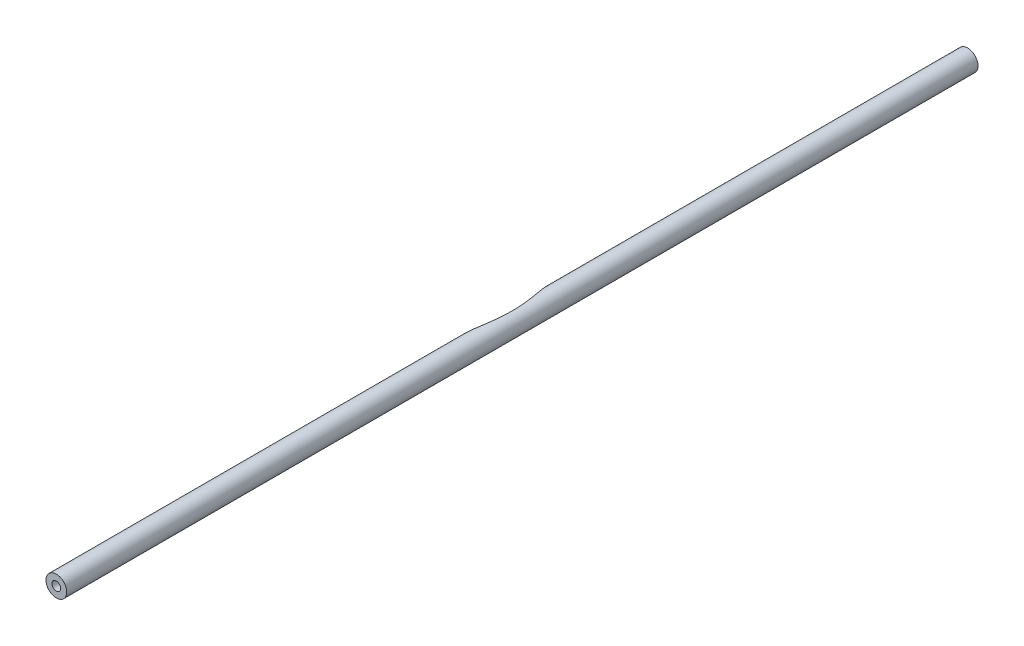
ISO-10303-21;
HEADER;
FILE_DESCRIPTION(('STEP AP214'),'2;1');
FILE_NAME('part.step','',(''),(''),'','','');
FILE_SCHEMA(('AUTOMOTIVE_DESIGN { 1 0 10303 214 1 1 1 1 }'));
ENDSEC;
DATA;
#1=APPLICATION_CONTEXT('core data for automotive mechanical design processes');
#2=APPLICATION_PROTOCOL_DEFINITION('international standard','automotive_design',2000,#1);
#3=PRODUCT_CONTEXT('',#1,'mechanical');
#4=PRODUCT('Part','Part','',(#3));
#5=PRODUCT_RELATED_PRODUCT_CATEGORY('part','',(#4));
#6=PRODUCT_DEFINITION_FORMATION('','',#4);
#7=PRODUCT_DEFINITION_CONTEXT('part definition',#1,'design');
#8=PRODUCT_DEFINITION('design','',#6,#7);
#9=PRODUCT_DEFINITION_SHAPE('','',#8);
#10=(LENGTH_UNIT() NAMED_UNIT(*) SI_UNIT(.MILLI.,.METRE.));
#11=(NAMED_UNIT(*) PLANE_ANGLE_UNIT() SI_UNIT($,.RADIAN.));
#12=(NAMED_UNIT(*) SI_UNIT($,.STERADIAN.) SOLID_ANGLE_UNIT());
#13=UNCERTAINTY_MEASURE_WITH_UNIT(LENGTH_MEASURE(1.E-05),#10,'distance_accuracy_value','');
#14=(GEOMETRIC_REPRESENTATION_CONTEXT(3) GLOBAL_UNCERTAINTY_ASSIGNED_CONTEXT((#13)) GLOBAL_UNIT_ASSIGNED_CONTEXT((#10,
#11,#12)) REPRESENTATION_CONTEXT('',''));
#15=CARTESIAN_POINT('',(0.,0.,0.));
#16=DIRECTION('',(0.,0.,1.));
#17=DIRECTION('',(1.,0.,0.));
#18=AXIS2_PLACEMENT_3D('',#15,#16,#17);
#19=CARTESIAN_POINT('',(0.,0.,-220.));
#20=DIRECTION('',(0.,0.,1.));
#21=DIRECTION('',(1.,0.,0.));
#22=AXIS2_PLACEMENT_3D('',#19,#20,#21);
#23=CYLINDRICAL_SURFACE('',#22,5.);
#24=CARTESIAN_POINT('',(0.,-5.,0.));
#25=CARTESIAN_POINT('',(5.98048745554765E-08,-4.99999894929826,0.417707577918695));
#26=CARTESIAN_POINT('',(-0.00447316842454203,-5.00000572152815,0.835411787074295));
#27=CARTESIAN_POINT('',(-0.0223640327096948,-4.99995826664365,1.67063726628699));
#28=CARTESIAN_POINT('',(-0.0357818154025074,-4.99990403852922,2.08815853323263));
#29=CARTESIAN_POINT('',(-0.0715571107148975,-4.99951986270451,2.92284683246875));
#30=CARTESIAN_POINT('',(-0.093915253298219,-4.99918989556309,3.34001383772069));
#31=CARTESIAN_POINT('',(-0.147560909040328,-4.99789414244653,4.17377229868555));
#32=CARTESIAN_POINT('',(-0.178848415093095,-4.99692835697739,4.59036375485623));
#33=CARTESIAN_POINT('',(-0.250516912833014,-4.99384966328313,5.42485904522883));
#34=CARTESIAN_POINT('',(-0.290942601030743,-4.9917310421289,5.84275902287125));
#35=CARTESIAN_POINT('',(-0.380776889621688,-4.98568309811106,6.67756891637324));
#36=CARTESIAN_POINT('',(-0.430185249470323,-4.98175382373013,7.09447885844192));
#37=CARTESIAN_POINT('',(-0.537946149838968,-4.97127192769807,7.92700720253108));
#38=CARTESIAN_POINT('',(-0.596296518090961,-4.96471994255644,8.34262589328153));
#39=CARTESIAN_POINT('',(-0.721914687736447,-4.94801526105068,9.17244265001416));
#40=CARTESIAN_POINT('',(-0.789182464997791,-4.93786257443059,9.58664071983768));
#41=CARTESIAN_POINT('',(-0.933276458326981,-4.91267729887402,10.4173326026176));
#42=CARTESIAN_POINT('',(-1.01018833746266,-4.89759874104744,10.833810212722));
#43=CARTESIAN_POINT('',(-1.17298344626658,-4.86117992039492,11.6647497447607));
#44=CARTESIAN_POINT('',(-1.25886686101188,-4.8398395283749,12.0792116249271));
#45=CARTESIAN_POINT('',(-1.43961253536604,-4.78918996446184,12.9062380219548));
#46=CARTESIAN_POINT('',(-1.53448584242253,-4.75987090279358,13.3187995335351));
#47=CARTESIAN_POINT('',(-1.73295806585678,-4.69125655935509,14.1409755672814));
#48=CARTESIAN_POINT('',(-1.83655647630113,-4.65196185576615,14.5505902588285));
#49=CARTESIAN_POINT('',(-2.05119630868726,-4.56136432500578,15.3622576083071));
#50=CARTESIAN_POINT('',(-2.16215573942821,-4.51018173657426,15.7643450754205));
#51=CARTESIAN_POINT('',(-2.39205353093678,-4.39258063984198,16.5641301472363));
#52=CARTESIAN_POINT('',(-2.51099391724757,-4.32615825329774,16.9618266074618));
#53=CARTESIAN_POINT('',(-2.75595276751979,-4.1743871634479,17.7504204575874));
#54=CARTESIAN_POINT('',(-2.88195345236026,-4.08908453415532,18.141331942608));
#55=CARTESIAN_POINT('',(-3.07561444599291,-3.94297844044993,18.7214304560374));
#56=CARTESIAN_POINT('',(-3.14092813653961,-3.89126599845971,18.9137053253748));
#57=CARTESIAN_POINT('',(-3.27291756123801,-3.78092947356627,19.2957785272647));
#58=CARTESIAN_POINT('',(-3.33959310017675,-3.72230637559598,19.4855772084607));
#59=CARTESIAN_POINT('',(-3.4550485975607,-3.61482685309579,19.8089507462537));
#60=CARTESIAN_POINT('',(-3.5035621669071,-3.56789073737287,19.9432597367399));
#61=CARTESIAN_POINT('',(-3.60102978249993,-3.46949324082166,20.2100677064277));
#62=CARTESIAN_POINT('',(-3.64998385939631,-3.41803154288915,20.3425665580414));
#63=CARTESIAN_POINT('',(-3.74840145702304,-3.30981319751915,20.6060412811268));
#64=CARTESIAN_POINT('',(-3.79786629663304,-3.25303213476149,20.7370066814364));
#65=CARTESIAN_POINT('',(-3.89684911100639,-3.13377886897074,20.9963049304593));
#66=CARTESIAN_POINT('',(-3.94636708508716,-3.07130673820151,21.1246378125743));
#67=CARTESIAN_POINT('',(-4.0583744899826,-2.92240687947659,21.4119600522195));
#68=CARTESIAN_POINT('',(-4.12079582371169,-2.83403755291774,21.5699820603759));
#69=CARTESIAN_POINT('',(-4.24450302227461,-2.64517546126514,21.8793407723043));
#70=CARTESIAN_POINT('',(-4.30578799815116,-2.54467363141446,22.0306723605752));
#71=CARTESIAN_POINT('',(-4.42554418584407,-2.33014315793481,22.3230476914135));
#72=CARTESIAN_POINT('',(-4.48403120980962,-2.2162075099452,22.46415237343));
#73=CARTESIAN_POINT('',(-4.59666555955973,-1.97198377312469,22.7331393980527));
#74=CARTESIAN_POINT('',(-4.65082170328285,-1.84173037274067,22.8610487696205));
#75=CARTESIAN_POINT('',(-4.73861581976625,-1.59920289141532,23.0666309914176));
#76=CARTESIAN_POINT('',(-4.77389781162023,-1.49124978202251,23.1486551281293));
#77=CARTESIAN_POINT('',(-4.83891610417778,-1.26443681624317,23.29900583807));
#78=CARTESIAN_POINT('',(-4.86865151062822,-1.14557520572506,23.367330202674));
#79=CARTESIAN_POINT('',(-4.92074634297944,-0.895917136765003,23.4865591897872));
#80=CARTESIAN_POINT('',(-4.94301626272151,-0.764998292298065,23.5372526824804));
#81=CARTESIAN_POINT('',(-4.97727873542102,-0.495060259673294,23.615078014192));
#82=CARTESIAN_POINT('',(-4.98928950333902,-0.356055898049044,23.6422516135542));
#83=CARTESIAN_POINT('',(-5.00086145217875,-0.0878465005493869,23.6684298248628));
#84=CARTESIAN_POINT('',(-5.00146832610088,0.0410804679665408,23.6698004893668));
#85=CARTESIAN_POINT('',(-4.99281860096677,0.296897078185104,23.6502365726649));
#86=CARTESIAN_POINT('',(-4.98355903660584,0.423786095755256,23.6292952857228));
#87=CARTESIAN_POINT('',(-4.95765176713256,0.659020949234648,23.5705145160179));
#88=CARTESIAN_POINT('',(-4.94183603255899,0.767951797868487,23.5345755455366));
#89=CARTESIAN_POINT('',(-4.90435858571185,0.979174856142201,23.4490862577332));
#90=CARTESIAN_POINT('',(-4.88269556383135,1.08146557222871,23.3995328911737));
#91=CARTESIAN_POINT('',(-4.81866123379227,1.34513083251545,23.2523616480387));
#92=CARTESIAN_POINT('',(-4.77216345157935,1.49995332389845,23.1448369665749));
#93=CARTESIAN_POINT('',(-4.67117731406636,1.78992752846766,22.908947584942));
#94=CARTESIAN_POINT('',(-4.61666335516293,1.92501333905605,22.7805159619968));
#95=CARTESIAN_POINT('',(-4.50864107046932,2.16509944776037,22.5231624157064));
#96=CARTESIAN_POINT('',(-4.45557681472885,2.2717572816773,22.3955724996858));
#97=CARTESIAN_POINT('',(-4.34713066799162,2.47295988476688,22.1320113266715));
#98=CARTESIAN_POINT('',(-4.29174682876626,2.56749418925142,21.9960329769543));
#99=CARTESIAN_POINT('',(-4.17963997540246,2.746224434971,21.7176537118176));
#100=CARTESIAN_POINT('',(-4.12291474191421,2.83040157061374,21.5752417373478));
#101=CARTESIAN_POINT('',(-4.00895001023727,2.98963070380607,21.2857140963652));
#102=CARTESIAN_POINT('',(-3.95171068076745,3.06468558551102,21.1385999352048));
#103=CARTESIAN_POINT('',(-3.81518927863015,3.23424385263108,20.7833642684202));
#104=CARTESIAN_POINT('',(-3.73589133750635,3.32513377597189,20.5735284040891));
#105=CARTESIAN_POINT('',(-3.57812215954788,3.49433882596433,20.1484968506665));
#106=CARTESIAN_POINT('',(-3.49965130362046,3.57264837663004,19.9332988334577));
#107=CARTESIAN_POINT('',(-3.34403500787087,3.71871347698896,19.4984942399071));
#108=CARTESIAN_POINT('',(-3.26689180383332,3.78645252897069,19.2788813643417));
#109=CARTESIAN_POINT('',(-3.11445722550238,3.91279318531084,18.836403085515));
#110=CARTESIAN_POINT('',(-3.03916605237586,3.97139380071502,18.6135373330801));
#111=CARTESIAN_POINT('',(-2.89038820126432,4.08095905435596,18.1641524546045));
#112=CARTESIAN_POINT('',(-2.81691144223542,4.13188724490038,17.9376212227885));
#113=CARTESIAN_POINT('',(-2.67233229186991,4.22683294591725,17.4823677884966));
#114=CARTESIAN_POINT('',(-2.60122995756532,4.27085029048982,17.2536455335633));
#115=CARTESIAN_POINT('',(-2.4616204800005,4.35281166107828,16.7945776609003));
#116=CARTESIAN_POINT('',(-2.39311095423915,4.39076137135174,16.5642337761102));
#117=CARTESIAN_POINT('',(-2.25872982157521,4.46137833592859,16.1019761793677));
#118=CARTESIAN_POINT('',(-2.19285824607814,4.49404552735619,15.8700624487643));
#119=CARTESIAN_POINT('',(-2.03552082237394,4.56806231785457,15.3027714117898));
#120=CARTESIAN_POINT('',(-1.94551276347614,4.60692856019252,14.9666646355142));
#121=CARTESIAN_POINT('',(-1.77131858604969,4.67666797983993,14.2921055697647));
#122=CARTESIAN_POINT('',(-1.68713299853558,4.70754042881098,13.9536530694474));
#123=CARTESIAN_POINT('',(-1.52469116776363,4.76263303975246,13.2746838356438));
#124=CARTESIAN_POINT('',(-1.44643677561239,4.78685113106004,12.9341664932454));
#125=CARTESIAN_POINT('',(-1.29597173374623,4.82975926801606,12.251442265691));
#126=CARTESIAN_POINT('',(-1.22376136226745,4.84844905926977,11.9092353035206));
#127=CARTESIAN_POINT('',(-1.08533283066156,4.88130345704158,11.2227882710711));
#128=CARTESIAN_POINT('',(-1.01912511296981,4.8954602821677,10.8785457269558));
#129=CARTESIAN_POINT('',(-0.892885290295208,4.92004868156309,10.1887941166971));
#130=CARTESIAN_POINT('',(-0.832853374170817,4.93048014193332,9.84328501215625));
#131=CARTESIAN_POINT('',(-0.662096693171913,4.9573166434217,8.80523704503186));
#132=CARTESIAN_POINT('',(-0.560681077744827,4.96927022676488,8.11102918444866));
#133=CARTESIAN_POINT('',(-0.382627653807178,4.98613878050529,6.71742238090323));
#134=CARTESIAN_POINT('',(-0.306059921917089,4.99103397607813,6.01801435046465));
#135=CARTESIAN_POINT('',(-0.178192763284592,4.99723410889104,4.61685389203272));
#136=CARTESIAN_POINT('',(-0.126894090998022,4.99853893893925,3.91510139467057));
#137=CARTESIAN_POINT('',(-0.0496845681267779,4.99990193877803,2.51105180493701));
#138=CARTESIAN_POINT('',(-0.0237431512179561,4.99996161128608,1.80875639205825));
#139=CARTESIAN_POINT('',(0.00282635921271862,5.00001651308659,0.403696282143364));
#140=CARTESIAN_POINT('',(0.00345474331280242,5.00001174311883,-0.299068409413122));
#141=CARTESIAN_POINT('',(-0.0212737604337173,4.99997248903954,-1.74338061257239));
#142=CARTESIAN_POINT('',(-0.0480828493019704,4.99993636143253,-2.48490364402855));
#143=CARTESIAN_POINT('',(-0.129883296499979,4.9984799157087,-3.966428072384));
#144=CARTESIAN_POINT('',(-0.184875969276262,4.99705953302921,-4.7064293966965));
#145=CARTESIAN_POINT('',(-0.32311645583398,4.99002931721683,-6.18544552576326));
#146=CARTESIAN_POINT('',(-0.406427511585859,4.98441007303086,-6.92445437286473));
#147=CARTESIAN_POINT('',(-0.601138723460831,4.96470095620674,-8.39861632889281));
#148=CARTESIAN_POINT('',(-0.712535811322781,4.95061200860952,-9.13376985004545));
#149=CARTESIAN_POINT('',(-0.900022457428622,4.91872776623521,-10.229709825857));
#150=CARTESIAN_POINT('',(-0.965618757360426,4.90637733677826,-10.5924764825481));
#151=CARTESIAN_POINT('',(-1.10361884739612,4.87719336792466,-11.3165271404419));
#152=CARTESIAN_POINT('',(-1.17602238512838,4.86035999468635,-11.6778111960926));
#153=CARTESIAN_POINT('',(-1.32761741134307,4.82115785074906,-12.3988547234793));
#154=CARTESIAN_POINT('',(-1.40681246384122,4.79878616191937,-12.7586132894686));
#155=CARTESIAN_POINT('',(-1.57186967715843,4.74728385158903,-13.4761124320965));
#156=CARTESIAN_POINT('',(-1.65773169699531,4.71815337298638,-13.8338530512359));
#157=CARTESIAN_POINT('',(-1.83563464906013,4.6518195027973,-14.5454865755076));
#158=CARTESIAN_POINT('',(-1.92764887982078,4.61464960875957,-14.8993892325862));
#159=CARTESIAN_POINT('',(-2.11799634267435,4.53044496352307,-15.6043664571068));
#160=CARTESIAN_POINT('',(-2.21633017156963,4.48340927967874,-15.9554407539141));
#161=CARTESIAN_POINT('',(-2.41892972781871,4.37742395813588,-16.6536784982002));
#162=CARTESIAN_POINT('',(-2.52318921027998,4.31848670184364,-17.0008456173492));
#163=CARTESIAN_POINT('',(-2.73730142441431,4.18605551240326,-17.6906098240708));
#164=CARTESIAN_POINT('',(-2.84715252054131,4.11256581786924,-18.0332082114147));
#165=CARTESIAN_POINT('',(-3.00855727956513,3.99402902721136,-18.5212245243473));
#166=CARTESIAN_POINT('',(-3.05812064314116,3.95625636011384,-18.6690840073138));
#167=CARTESIAN_POINT('',(-3.15811067233034,3.87690827734068,-18.9634909480863));
#168=CARTESIAN_POINT('',(-3.20853733590509,3.83533287064292,-19.1100384089889));
#169=CARTESIAN_POINT('',(-3.31019586790912,3.74794593333724,-19.4017280300812));
#170=CARTESIAN_POINT('',(-3.36142834491129,3.70213105952785,-19.5468689797437));
#171=CARTESIAN_POINT('',(-3.4645356937074,3.60582453316669,-19.835371000051));
#172=CARTESIAN_POINT('',(-3.51641058075093,3.55533276940939,-19.9787320282814));
#173=CARTESIAN_POINT('',(-3.62061914395741,3.44915198741046,-20.2632796462795));
#174=CARTESIAN_POINT('',(-3.67295261919986,3.39346515130788,-20.4044671202528));
#175=CARTESIAN_POINT('',(-3.77788617497061,3.27624258323311,-20.6842886169932));
#176=CARTESIAN_POINT('',(-3.830486232349,3.21470735116598,-20.8229228567968));
#177=CARTESIAN_POINT('',(-3.93560958838556,3.08511452797687,-21.0969010162168));
#178=CARTESIAN_POINT('',(-3.98813289513612,3.01706582005104,-21.2322491102177));
#179=CARTESIAN_POINT('',(-4.09281334115064,2.87346114532701,-21.4991217212621));
#180=CARTESIAN_POINT('',(-4.14497039079215,2.79790340522222,-21.6306453256032));
#181=CARTESIAN_POINT('',(-4.2490356464422,2.63722899287747,-21.8903978721043));
#182=CARTESIAN_POINT('',(-4.30093270872887,2.55200521654226,-22.0185655742323));
#183=CARTESIAN_POINT('',(-4.40302962885606,2.37151381332953,-22.2682724218684));
#184=CARTESIAN_POINT('',(-4.45323058696051,2.27625286945055,-22.3898158971632));
#185=CARTESIAN_POINT('',(-4.55058117051233,2.07476703823351,-22.6234196658864));
#186=CARTESIAN_POINT('',(-4.59774798514415,1.96861479486142,-22.7355347421094));
#187=CARTESIAN_POINT('',(-4.68775565826909,1.74344961318782,-22.9477974436997));
#188=CARTESIAN_POINT('',(-4.73060405509848,1.62445986370747,-23.0479659813434));
#189=CARTESIAN_POINT('',(-4.80279286951076,1.39462907093936,-23.2156182144385));
#190=CARTESIAN_POINT('',(-4.83318182230714,1.28607312080306,-23.2857489807822));
#191=CARTESIAN_POINT('',(-4.88790014574705,1.05925529374103,-23.4114791582528));
#192=CARTESIAN_POINT('',(-4.912229605467,0.940993559527317,-23.4670787829926));
#193=CARTESIAN_POINT('',(-4.95309947591493,0.694635667842514,-23.5602064305963));
#194=CARTESIAN_POINT('',(-4.96955541381221,0.56644928241826,-23.5975385590483));
#195=CARTESIAN_POINT('',(-4.99242791172136,0.304692740658139,-23.649368255959));
#196=CARTESIAN_POINT('',(-4.99885816707036,0.171130184773462,-23.6638969746362));
#197=CARTESIAN_POINT('',(-5.00076984518739,-0.0840203338153848,-23.6682184938556));
#198=CARTESIAN_POINT('',(-4.99721263935676,-0.205568404330698,-23.6601832411598));
#199=CARTESIAN_POINT('',(-4.98158631641885,-0.445255259733036,-23.624808374983));
#200=CARTESIAN_POINT('',(-4.96951164077635,-0.563391765783324,-23.5974561551575));
#201=CARTESIAN_POINT('',(-4.93471890414986,-0.817483181249368,-23.518370052202));
#202=CARTESIAN_POINT('',(-4.91029782549125,-0.951967852026539,-23.4627213271827));
#203=CARTESIAN_POINT('',(-4.85334125008006,-1.20936329893185,-23.3321716114533));
#204=CARTESIAN_POINT('',(-4.82079085156077,-1.33225224268384,-23.2572352569975));
#205=CARTESIAN_POINT('',(-4.75787439599084,-1.54001393168273,-23.1113831253995));
#206=CARTESIAN_POINT('',(-4.72863425825511,-1.62726085006484,-23.0432837490642));
#207=CARTESIAN_POINT('',(-4.66754990843844,-1.79497863751702,-22.9001913827597));
#208=CARTESIAN_POINT('',(-4.63570416327731,-1.87544545999514,-22.825194331088));
#209=CARTESIAN_POINT('',(-4.57006186657282,-2.03017508349517,-22.6696342556695));
#210=CARTESIAN_POINT('',(-4.53626225687056,-2.10442768778631,-22.5890624653725));
#211=CARTESIAN_POINT('',(-4.4672712558021,-2.24716791388303,-22.4235053897729));
#212=CARTESIAN_POINT('',(-4.43207932170851,-2.31565325441255,-22.3385183792963));
#213=CARTESIAN_POINT('',(-4.32725272140871,-2.50918935747712,-22.083587424721));
#214=CARTESIAN_POINT('',(-4.25627176141854,-2.62704758830124,-21.9087234729345));
#215=CARTESIAN_POINT('',(-4.11267649063719,-2.84658969340514,-21.5497244400972));
#216=CARTESIAN_POINT('',(-4.04006065369438,-2.94825767345803,-21.3655804792892));
#217=CARTESIAN_POINT('',(-3.89432107421903,-3.1382509004669,-20.9902366639648));
#218=CARTESIAN_POINT('',(-3.82119658300069,-3.22654752123953,-20.7990227320487));
#219=CARTESIAN_POINT('',(-3.67544556138599,-3.39163626418607,-20.4116683514085));
#220=CARTESIAN_POINT('',(-3.60281884189265,-3.46843301601195,-20.2155299225381));
#221=CARTESIAN_POINT('',(-3.42230032874218,-3.64847432823085,-19.7197167152299));
#222=CARTESIAN_POINT('',(-3.3150458003346,-3.74559135091396,-19.4175888931578));
#223=CARTESIAN_POINT('',(-3.10401291546766,-3.92224309901038,-18.8069819685913));
#224=CARTESIAN_POINT('',(-3.00023628825527,-4.0017691849366,-18.4984998262214));
#225=CARTESIAN_POINT('',(-2.79673614274437,-4.14655031370228,-17.8762664751178));
#226=CARTESIAN_POINT('',(-2.6970203838986,-4.21177899153373,-17.5625066619948));
#227=CARTESIAN_POINT('',(-2.50233149798676,-4.33027813858562,-16.9313712725983));
#228=CARTESIAN_POINT('',(-2.40735757078172,-4.38355063063738,-16.6139963175218));
#229=CARTESIAN_POINT('',(-2.22200636499937,-4.48036440368933,-15.974796053038));
#230=CARTESIAN_POINT('',(-2.13165282897491,-4.52385869604137,-15.6529568270186));
#231=CARTESIAN_POINT('',(-1.95623484154862,-4.60243159045047,-15.0068212287332));
#232=CARTESIAN_POINT('',(-1.87117056119442,-4.63750992045106,-14.6825247773839));
#233=CARTESIAN_POINT('',(-1.7065587631852,-4.7005762267451,-14.0321885628022));
#234=CARTESIAN_POINT('',(-1.62700606994061,-4.72857092221535,-13.7061507534337));
#235=CARTESIAN_POINT('',(-1.47342863092304,-4.77865289261182,-13.0523200839132));
#236=CARTESIAN_POINT('',(-1.39940409764439,-4.80073994054093,-12.7245271568154));
#237=CARTESIAN_POINT('',(-1.21790521028475,-4.85075513461558,-11.8872791585697));
#238=CARTESIAN_POINT('',(-1.11434502608637,-4.87524567036435,-11.3767659213151));
#239=CARTESIAN_POINT('',(-0.920840543010473,-4.91546521788261,-10.3528138129352));
#240=CARTESIAN_POINT('',(-0.830897128343993,-4.93119366085923,-9.83937475406479));
#241=CARTESIAN_POINT('',(-0.664703174190872,-4.95633281130677,-8.80988224047414));
#242=CARTESIAN_POINT('',(-0.588459281123923,-4.96574045822915,-8.29382764097012));
#243=CARTESIAN_POINT('',(-0.449795121113221,-4.98021489037703,-7.25982140945204));
#244=CARTESIAN_POINT('',(-0.387374541798643,-4.98528177369989,-6.74186982057391));
#245=CARTESIAN_POINT('',(-0.276621948311715,-4.99264931033952,-5.70648082185631));
#246=CARTESIAN_POINT('',(-0.228236140689208,-4.99496063428542,-5.18904923237883));
#247=CARTESIAN_POINT('',(-0.145265931307635,-4.99806174146322,-4.15307305025471));
#248=CARTESIAN_POINT('',(-0.110681632547686,-4.99885151334012,-3.63452844933084));
#249=CARTESIAN_POINT('',(-0.0553467964402754,-4.99977012002906,-2.59683365910661));
#250=CARTESIAN_POINT('',(-0.0345927619511346,-4.99989912197961,-2.07768365617481));
#251=CARTESIAN_POINT('',(-0.00691951315822816,-5.00001471419468,-1.03902069452313));
#252=CARTESIAN_POINT('',(-7.43800136102337E-08,-5.0000013067699,-0.519507741829134));
#253=CARTESIAN_POINT('',(0.,-5.,0.));
#254=B_SPLINE_CURVE_WITH_KNOTS('',3,(#24,#25,#26,#27,#28,#29,#30,#31,#32,#33,#34,#35,#36,#37,
#38,#39,#40,#41,#42,#43,#44,#45,#46,#47,#48,#49,#50,#51,#52,#53,#54,#55,#56,#57,#58,#59,#60,#61,
#62,#63,#64,#65,#66,#67,#68,#69,#70,#71,#72,#73,#74,#75,#76,#77,#78,#79,#80,#81,#82,#83,#84,#85,
#86,#87,#88,#89,#90,#91,#92,#93,#94,#95,#96,#97,#98,#99,#100,#101,#102,#103,#104,#105,#106,#107,
#108,#109,#110,#111,#112,#113,#114,#115,#116,#117,#118,#119,#120,#121,#122,#123,#124,#125,#126,
#127,#128,#129,#130,#131,#132,#133,#134,#135,#136,#137,#138,#139,#140,#141,#142,#143,#144,#145,
#146,#147,#148,#149,#150,#151,#152,#153,#154,#155,#156,#157,#158,#159,#160,#161,#162,#163,#164,
#165,#166,#167,#168,#169,#170,#171,#172,#173,#174,#175,#176,#177,#178,#179,#180,#181,#182,#183,
#184,#185,#186,#187,#188,#189,#190,#191,#192,#193,#194,#195,#196,#197,#198,#199,#200,#201,#202,
#203,#204,#205,#206,#207,#208,#209,#210,#211,#212,#213,#214,#215,#216,#217,#218,#219,#220,#221,
#222,#223,#224,#225,#226,#227,#228,#229,#230,#231,#232,#233,#234,#235,#236,#237,#238,#239,#240,
#241,#242,#243,#244,#245,#246,#247,#248,#249,#250,#251,#252,#253),.UNSPECIFIED.,.T.,.F.,(4,2,2,
2,2,2,2,2,2,2,2,2,2,2,2,2,2,2,2,2,2,2,2,2,2,2,2,2,2,2,2,2,2,2,2,2,2,2,2,2,2,2,2,2,2,2,2,2,2,2,2,
2,2,2,2,2,2,2,2,2,2,2,2,2,2,2,2,2,2,2,2,2,2,2,2,2,2,2,2,2,2,2,2,2,2,2,2,2,2,2,2,2,2,2,2,2,2,2,2,
2,2,2,2,2,2,2,2,2,2,2,2,2,2,2,4),(0.,1.25309295061972,2.50620644495758,3.75940825287832,
5.01260906349917,6.27207748668408,7.53151218786452,8.79064142014092,10.0497672450514,
11.3209961317636,12.5922512482986,13.8650893540729,15.1378537038682,16.3982659903291,
17.6589993845969,18.9166894460845,19.5452254008131,20.173671882272,20.6245578983721,
21.0754755329349,21.5285749776903,21.9816686698947,22.5557850844241,23.1303331341563,
23.7011146726983,24.2707027974511,24.6900389117342,25.109442575526,25.533708388461,
25.9572193490684,26.3416849703161,26.7262661732291,27.0723659153244,27.4185432371985,
27.9976319802282,28.5786122057986,29.101524133643,29.624884429076,30.1491813935938,
30.6733121591255,31.3989065329903,32.1248216292677,32.8518585906885,33.5789741769449,
34.3094418062033,35.0399269681881,35.7697237386692,36.4995291950011,37.5496929672658,
38.5999523894481,39.6505382558522,40.7011724593475,41.7536006546069,42.8060610239783,
44.9105276940157,47.0208788716808,49.1312930540758,51.239160137149,53.3470030231825,
55.5724850843223,57.7980709485633,60.0286601141139,62.2590057042536,63.3655002204054,
64.4719537305275,65.5789914749183,66.686005815848,67.7884935287541,68.8910855104584,
69.9925363022782,71.0936667508024,71.5749893896148,72.056310892103,72.5380152482954,
73.019731061235,73.5012454374779,73.9827186921279,74.4635444153239,74.9444839596786,
75.4313991161743,75.9179920968424,76.4015279346619,76.8842045232246,77.2814532620682,
77.6786961608878,78.0801103730603,78.4809757612906,78.8446122375031,79.2084862441623,
79.6487999144436,80.0899267204323,80.4328853445161,80.7760472291228,81.1197615872769,
81.4636112712816,82.1299655709276,82.7969700611952,83.4653829180097,84.1335259555011,
85.1377517265771,86.1424696162064,87.1490249441702,88.1554098474566,89.1665321526844,
90.177687139298,91.1878793693513,92.1981104097414,93.7622616551367,95.3265144258698,
96.89152406772,98.456498340826,100.015392516039,101.574298324888,103.132809796715,
104.691295980571),.UNSPECIFIED.);
#255=CARTESIAN_POINT('',(0.,-5.,0.));
#256=VERTEX_POINT('',#255);
#257=EDGE_CURVE('E11',#256,#256,#254,.T.);
#258=ORIENTED_EDGE('',*,*,#257,.F.);
#259=EDGE_LOOP('',(#258));
#260=FACE_BOUND('',#259,.T.);
#261=CARTESIAN_POINT('',(0.,0.,-220.));
#262=DIRECTION('',(0.,0.,1.));
#263=DIRECTION('',(1.,0.,0.));
#264=AXIS2_PLACEMENT_3D('',#261,#262,#263);
#265=CIRCLE('',#264,5.);
#266=CARTESIAN_POINT('',(5.,0.,-220.));
#267=VERTEX_POINT('',#266);
#268=EDGE_CURVE('E46',#267,#267,#265,.T.);
#269=ORIENTED_EDGE('',*,*,#268,.T.);
#270=EDGE_LOOP('',(#269));
#271=FACE_BOUND('',#270,.T.);
#272=CARTESIAN_POINT('',(0.,0.,220.));
#273=DIRECTION('',(0.,0.,1.));
#274=DIRECTION('',(1.,0.,0.));
#275=AXIS2_PLACEMENT_3D('',#272,#273,#274);
#276=CIRCLE('',#275,5.);
#277=CARTESIAN_POINT('',(5.,0.,220.));
#278=VERTEX_POINT('',#277);
#279=EDGE_CURVE('E73',#278,#278,#276,.T.);
#280=ORIENTED_EDGE('',*,*,#279,.F.);
#281=EDGE_LOOP('',(#280));
#282=FACE_BOUND('',#281,.T.);
#283=ADVANCED_FACE('F34',(#260,#271,#282),#23,.T.);
#284=CARTESIAN_POINT('',(0.,0.,-220.));
#285=DIRECTION('',(0.,0.,1.));
#286=DIRECTION('',(1.,0.,0.));
#287=AXIS2_PLACEMENT_3D('',#284,#285,#286);
#288=PLANE('',#287);
#289=CARTESIAN_POINT('',(0.,0.,-220.));
#290=DIRECTION('',(0.,0.,-1.));
#291=DIRECTION('',(-1.,0.,0.));
#292=AXIS2_PLACEMENT_3D('',#289,#290,#291);
#293=CIRCLE('',#292,2.09999999999999);
#294=CARTESIAN_POINT('',(-2.09999999999999,0.,-220.));
#295=VERTEX_POINT('',#294);
#296=EDGE_CURVE('E63',#295,#295,#293,.T.);
#297=ORIENTED_EDGE('',*,*,#296,.F.);
#298=EDGE_LOOP('',(#297));
#299=FACE_BOUND('',#298,.T.);
#300=ORIENTED_EDGE('',*,*,#268,.F.);
#301=EDGE_LOOP('',(#300));
#302=FACE_BOUND('',#301,.T.);
#303=ADVANCED_FACE('F80',(#299,#302),#288,.F.);
#304=CARTESIAN_POINT('',(0.,0.,220.));
#305=DIRECTION('',(0.,0.,1.));
#306=DIRECTION('',(1.,0.,0.));
#307=AXIS2_PLACEMENT_3D('',#304,#305,#306);
#308=PLANE('',#307);
#309=CARTESIAN_POINT('',(0.,0.,220.));
#310=DIRECTION('',(0.,0.,1.));
#311=DIRECTION('',(1.,0.,0.));
#312=AXIS2_PLACEMENT_3D('',#309,#310,#311);
#313=CIRCLE('',#312,2.09999999999999);
#314=CARTESIAN_POINT('',(2.09999999999999,0.,220.));
#315=VERTEX_POINT('',#314);
#316=EDGE_CURVE('E62',#315,#315,#313,.T.);
#317=ORIENTED_EDGE('',*,*,#316,.F.);
#318=EDGE_LOOP('',(#317));
#319=FACE_BOUND('',#318,.T.);
#320=ORIENTED_EDGE('',*,*,#279,.T.);
#321=EDGE_LOOP('',(#320));
#322=FACE_BOUND('',#321,.T.);
#323=ADVANCED_FACE('F82',(#319,#322),#308,.T.);
#324=CARTESIAN_POINT('',(0.,0.,180.));
#325=DIRECTION('',(0.,0.,1.));
#326=DIRECTION('',(1.,0.,0.));
#327=AXIS2_PLACEMENT_3D('',#324,#325,#326);
#328=CONICAL_SURFACE('',#327,2.09999999999999,1.02974425867665);
#329=CARTESIAN_POINT('',(0.,0.,178.738192700042));
#330=VERTEX_POINT('',#329);
#331=VERTEX_LOOP('',#330);
#332=FACE_BOUND('',#331,.T.);
#333=CARTESIAN_POINT('',(0.,0.,180.));
#334=DIRECTION('',(0.,0.,1.));
#335=DIRECTION('',(1.,0.,0.));
#336=AXIS2_PLACEMENT_3D('',#333,#334,#335);
#337=CIRCLE('',#336,2.09999999999999);
#338=CARTESIAN_POINT('',(2.09999999999999,0.,180.));
#339=VERTEX_POINT('',#338);
#340=EDGE_CURVE('E66',#339,#339,#337,.T.);
#341=ORIENTED_EDGE('',*,*,#340,.T.);
#342=EDGE_LOOP('',(#341));
#343=FACE_BOUND('',#342,.T.);
#344=ADVANCED_FACE('F88',(#332,#343),#328,.F.);
#345=CARTESIAN_POINT('',(0.,0.,220.));
#346=DIRECTION('',(0.,0.,1.));
#347=DIRECTION('',(1.,0.,0.));
#348=AXIS2_PLACEMENT_3D('',#345,#346,#347);
#349=CYLINDRICAL_SURFACE('',#348,2.09999999999999);
#350=ORIENTED_EDGE('',*,*,#340,.F.);
#351=EDGE_LOOP('',(#350));
#352=FACE_BOUND('',#351,.T.);
#353=ORIENTED_EDGE('',*,*,#316,.T.);
#354=EDGE_LOOP('',(#353));
#355=FACE_BOUND('',#354,.T.);
#356=ADVANCED_FACE('F56',(#352,#355),#349,.F.);
#357=CARTESIAN_POINT('',(0.,0.,-180.));
#358=DIRECTION('',(0.,0.,-1.));
#359=DIRECTION('',(-1.,0.,0.));
#360=AXIS2_PLACEMENT_3D('',#357,#358,#359);
#361=CONICAL_SURFACE('',#360,2.09999999999999,1.02974425867665);
#362=CARTESIAN_POINT('',(0.,0.,-178.738192700042));
#363=VERTEX_POINT('',#362);
#364=VERTEX_LOOP('',#363);
#365=FACE_BOUND('',#364,.T.);
#366=CARTESIAN_POINT('',(0.,0.,-180.));
#367=DIRECTION('',(0.,0.,-1.));
#368=DIRECTION('',(-1.,0.,0.));
#369=AXIS2_PLACEMENT_3D('',#366,#367,#368);
#370=CIRCLE('',#369,2.09999999999999);
#371=CARTESIAN_POINT('',(-2.09999999999999,0.,-180.));
#372=VERTEX_POINT('',#371);
#373=EDGE_CURVE('E60',#372,#372,#370,.T.);
#374=ORIENTED_EDGE('',*,*,#373,.T.);
#375=EDGE_LOOP('',(#374));
#376=FACE_BOUND('',#375,.T.);
#377=ADVANCED_FACE('F52',(#365,#376),#361,.F.);
#378=CARTESIAN_POINT('',(0.,0.,-220.));
#379=DIRECTION('',(0.,0.,-1.));
#380=DIRECTION('',(-1.,0.,0.));
#381=AXIS2_PLACEMENT_3D('',#378,#379,#380);
#382=CYLINDRICAL_SURFACE('',#381,2.09999999999999);
#383=ORIENTED_EDGE('',*,*,#373,.F.);
#384=EDGE_LOOP('',(#383));
#385=FACE_BOUND('',#384,.T.);
#386=ORIENTED_EDGE('',*,*,#296,.T.);
#387=EDGE_LOOP('',(#386));
#388=FACE_BOUND('',#387,.T.);
#389=ADVANCED_FACE('F55',(#385,#388),#382,.F.);
#390=CARTESIAN_POINT('',(-58.5102192834596,-5.,0.));
#391=DIRECTION('',(0.,1.,0.));
#392=DIRECTION('',(0.,0.,1.));
#393=AXIS2_PLACEMENT_3D('',#390,#391,#392);
#394=CYLINDRICAL_SURFACE('',#393,58.5102192834596);
#395=ORIENTED_EDGE('',*,*,#257,.T.);
#396=EDGE_LOOP('',(#395));
#397=FACE_BOUND('',#396,.T.);
#398=ADVANCED_FACE('F100',(#397),#394,.F.);
#399=CLOSED_SHELL('',(#283,#303,#323,#344,#356,#377,#389,#398));
#400=MANIFOLD_SOLID_BREP('B2',#399);
#401=ADVANCED_BREP_SHAPE_REPRESENTATION('',(#18,#400),#14);
#402=SHAPE_DEFINITION_REPRESENTATION(#9,#401);
ENDSEC;
END-ISO-10303-21;
